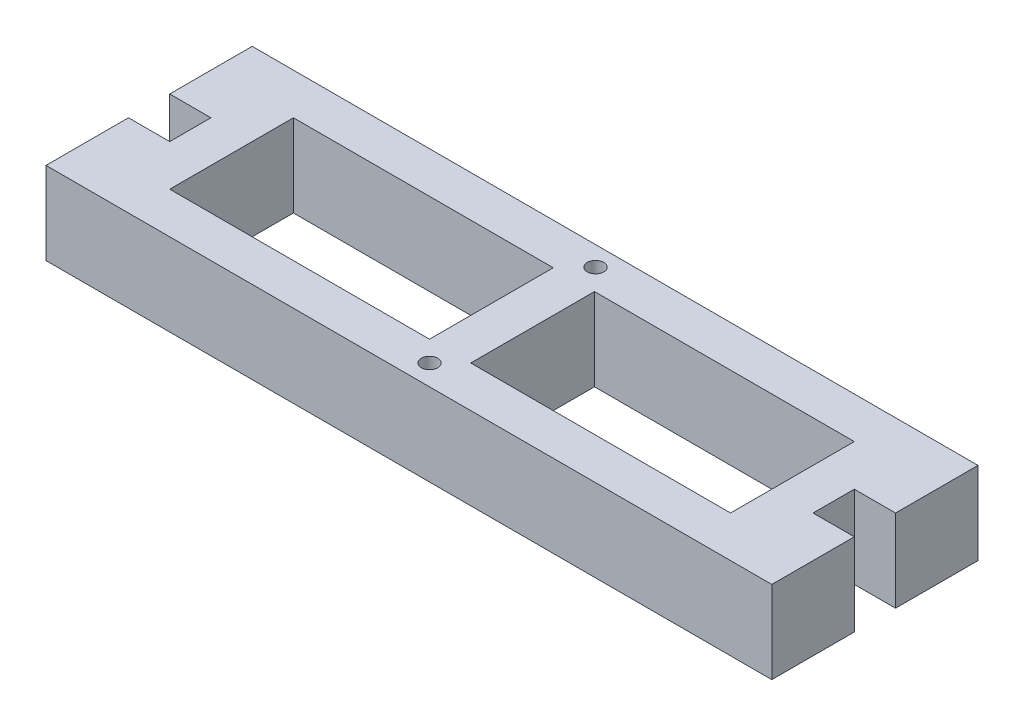
ISO-10303-21;
HEADER;
FILE_DESCRIPTION(('STEP AP214'),'2;1');
FILE_NAME('part.step','',(''),(''),'','','');
FILE_SCHEMA(('AUTOMOTIVE_DESIGN { 1 0 10303 214 1 1 1 1 }'));
ENDSEC;
DATA;
#1=APPLICATION_CONTEXT('core data for automotive mechanical design processes');
#2=APPLICATION_PROTOCOL_DEFINITION('international standard','automotive_design',2000,#1);
#3=PRODUCT_CONTEXT('',#1,'mechanical');
#4=PRODUCT('Part','Part','',(#3));
#5=PRODUCT_RELATED_PRODUCT_CATEGORY('part','',(#4));
#6=PRODUCT_DEFINITION_FORMATION('','',#4);
#7=PRODUCT_DEFINITION_CONTEXT('part definition',#1,'design');
#8=PRODUCT_DEFINITION('design','',#6,#7);
#9=PRODUCT_DEFINITION_SHAPE('','',#8);
#10=(LENGTH_UNIT() NAMED_UNIT(*) SI_UNIT(.MILLI.,.METRE.));
#11=(NAMED_UNIT(*) PLANE_ANGLE_UNIT() SI_UNIT($,.RADIAN.));
#12=(NAMED_UNIT(*) SI_UNIT($,.STERADIAN.) SOLID_ANGLE_UNIT());
#13=UNCERTAINTY_MEASURE_WITH_UNIT(LENGTH_MEASURE(1.E-05),#10,'distance_accuracy_value','');
#14=(GEOMETRIC_REPRESENTATION_CONTEXT(3) GLOBAL_UNCERTAINTY_ASSIGNED_CONTEXT((#13)) GLOBAL_UNIT_ASSIGNED_CONTEXT((#10,
#11,#12)) REPRESENTATION_CONTEXT('',''));
#15=CARTESIAN_POINT('',(0.,0.,0.));
#16=DIRECTION('',(0.,0.,1.));
#17=DIRECTION('',(1.,0.,0.));
#18=AXIS2_PLACEMENT_3D('',#15,#16,#17);
#19=CARTESIAN_POINT('',(0.,19.5,-10.1293473527723));
#20=DIRECTION('',(0.,-1.,0.));
#21=DIRECTION('',(0.,0.,-1.));
#22=AXIS2_PLACEMENT_3D('',#19,#20,#21);
#23=CYLINDRICAL_SURFACE('',#22,1.);
#24=CARTESIAN_POINT('',(0.,10.,-10.1293473527723));
#25=DIRECTION('',(0.,1.,0.));
#26=DIRECTION('',(0.,0.,1.));
#27=AXIS2_PLACEMENT_3D('',#24,#25,#26);
#28=CIRCLE('',#27,1.);
#29=CARTESIAN_POINT('',(0.,10.,-9.12934735277232));
#30=VERTEX_POINT('',#29);
#31=EDGE_CURVE('E347',#30,#30,#28,.T.);
#32=ORIENTED_EDGE('',*,*,#31,.T.);
#33=EDGE_LOOP('',(#32));
#34=FACE_BOUND('',#33,.T.);
#35=CARTESIAN_POINT('',(0.,1.5,-10.1293473527723));
#36=DIRECTION('',(0.,-1.,0.));
#37=DIRECTION('',(0.,0.,-1.));
#38=AXIS2_PLACEMENT_3D('',#35,#36,#37);
#39=CIRCLE('',#38,1.);
#40=CARTESIAN_POINT('',(0.,1.5,-11.1293473527723));
#41=VERTEX_POINT('',#40);
#42=EDGE_CURVE('E47',#41,#41,#39,.F.);
#43=ORIENTED_EDGE('',*,*,#42,.F.);
#44=EDGE_LOOP('',(#43));
#45=FACE_BOUND('',#44,.T.);
#46=ADVANCED_FACE('F43',(#34,#45),#23,.F.);
#47=CARTESIAN_POINT('',(-44.,0.,0.));
#48=DIRECTION('',(1.,0.,0.));
#49=DIRECTION('',(0.,0.,-1.));
#50=AXIS2_PLACEMENT_3D('',#47,#48,#49);
#51=PLANE('',#50);
#52=DIRECTION('',(0.,0.,1.));
#53=VECTOR('',#52,1.);
#54=CARTESIAN_POINT('',(-44.,0.,-12.5));
#55=LINE('',#54,#53);
#56=CARTESIAN_POINT('',(-44.,0.,-12.5));
#57=VERTEX_POINT('',#56);
#58=CARTESIAN_POINT('',(-44.,0.,-2.5));
#59=VERTEX_POINT('',#58);
#60=EDGE_CURVE('E262',#57,#59,#55,.T.);
#61=ORIENTED_EDGE('',*,*,#60,.T.);
#62=DIRECTION('',(0.,-1.,0.));
#63=VECTOR('',#62,1.);
#64=CARTESIAN_POINT('',(-44.,0.,-2.5));
#65=LINE('',#64,#63);
#66=CARTESIAN_POINT('',(-44.,10.,-2.5));
#67=VERTEX_POINT('',#66);
#68=EDGE_CURVE('E187',#67,#59,#65,.T.);
#69=ORIENTED_EDGE('',*,*,#68,.F.);
#70=DIRECTION('',(0.,0.,-1.));
#71=VECTOR('',#70,1.);
#72=CARTESIAN_POINT('',(-44.,10.,-12.5));
#73=LINE('',#72,#71);
#74=CARTESIAN_POINT('',(-44.,10.,-12.5));
#75=VERTEX_POINT('',#74);
#76=EDGE_CURVE('E266',#67,#75,#73,.T.);
#77=ORIENTED_EDGE('',*,*,#76,.T.);
#78=DIRECTION('',(0.,-1.,0.));
#79=VECTOR('',#78,1.);
#80=CARTESIAN_POINT('',(-44.,0.,-12.5));
#81=LINE('',#80,#79);
#82=EDGE_CURVE('E258',#75,#57,#81,.T.);
#83=ORIENTED_EDGE('',*,*,#82,.T.);
#84=EDGE_LOOP('',(#61,#69,#77,#83));
#85=FACE_BOUND('',#84,.T.);
#86=ADVANCED_FACE('F400',(#85),#51,.F.);
#87=CARTESIAN_POINT('',(44.,0.,0.));
#88=DIRECTION('',(-1.,0.,0.));
#89=DIRECTION('',(0.,0.,1.));
#90=AXIS2_PLACEMENT_3D('',#87,#88,#89);
#91=PLANE('',#90);
#92=DIRECTION('',(0.,0.,-1.));
#93=VECTOR('',#92,1.);
#94=CARTESIAN_POINT('',(44.,0.,-12.5));
#95=LINE('',#94,#93);
#96=CARTESIAN_POINT('',(44.,0.,12.5));
#97=VERTEX_POINT('',#96);
#98=CARTESIAN_POINT('',(44.,0.,2.5));
#99=VERTEX_POINT('',#98);
#100=EDGE_CURVE('E255',#97,#99,#95,.T.);
#101=ORIENTED_EDGE('',*,*,#100,.T.);
#102=DIRECTION('',(0.,-1.,0.));
#103=VECTOR('',#102,1.);
#104=CARTESIAN_POINT('',(44.,10.,2.5));
#105=LINE('',#104,#103);
#106=CARTESIAN_POINT('',(44.,10.,2.5));
#107=VERTEX_POINT('',#106);
#108=EDGE_CURVE('E217',#107,#99,#105,.T.);
#109=ORIENTED_EDGE('',*,*,#108,.F.);
#110=DIRECTION('',(0.,0.,1.));
#111=VECTOR('',#110,1.);
#112=CARTESIAN_POINT('',(44.,10.,-12.5));
#113=LINE('',#112,#111);
#114=CARTESIAN_POINT('',(44.,10.,12.5));
#115=VERTEX_POINT('',#114);
#116=EDGE_CURVE('E248',#107,#115,#113,.T.);
#117=ORIENTED_EDGE('',*,*,#116,.T.);
#118=DIRECTION('',(0.,-1.,0.));
#119=VECTOR('',#118,1.);
#120=CARTESIAN_POINT('',(44.,10.,12.5));
#121=LINE('',#120,#119);
#122=EDGE_CURVE('E252',#115,#97,#121,.T.);
#123=ORIENTED_EDGE('',*,*,#122,.T.);
#124=EDGE_LOOP('',(#101,#109,#117,#123));
#125=FACE_BOUND('',#124,.T.);
#126=ADVANCED_FACE('F408',(#125),#91,.F.);
#127=CARTESIAN_POINT('',(0.,10.,0.));
#128=DIRECTION('',(0.,1.,0.));
#129=DIRECTION('',(0.,0.,1.));
#130=AXIS2_PLACEMENT_3D('',#127,#128,#129);
#131=PLANE('',#130);
#132=ORIENTED_EDGE('',*,*,#31,.F.);
#133=EDGE_LOOP('',(#132));
#134=FACE_BOUND('',#133,.T.);
#135=CARTESIAN_POINT('',(0.,10.,10.));
#136=DIRECTION('',(0.,1.,0.));
#137=DIRECTION('',(0.,0.,1.));
#138=AXIS2_PLACEMENT_3D('',#135,#136,#137);
#139=CIRCLE('',#138,1.);
#140=CARTESIAN_POINT('',(0.,10.,11.));
#141=VERTEX_POINT('',#140);
#142=EDGE_CURVE('E339',#141,#141,#139,.T.);
#143=ORIENTED_EDGE('',*,*,#142,.F.);
#144=EDGE_LOOP('',(#143));
#145=FACE_BOUND('',#144,.T.);
#146=DIRECTION('',(-1.,0.,0.));
#147=VECTOR('',#146,1.);
#148=CARTESIAN_POINT('',(-39.,10.,-2.5));
#149=LINE('',#148,#147);
#150=CARTESIAN_POINT('',(-39.,10.,-2.5));
#151=VERTEX_POINT('',#150);
#152=EDGE_CURVE('E215',#151,#67,#149,.T.);
#153=ORIENTED_EDGE('',*,*,#152,.F.);
#154=DIRECTION('',(0.,0.,-1.));
#155=VECTOR('',#154,1.);
#156=CARTESIAN_POINT('',(-39.,10.,-2.5));
#157=LINE('',#156,#155);
#158=CARTESIAN_POINT('',(-39.,10.,2.5));
#159=VERTEX_POINT('',#158);
#160=EDGE_CURVE('E192',#159,#151,#157,.T.);
#161=ORIENTED_EDGE('',*,*,#160,.F.);
#162=DIRECTION('',(-1.,0.,0.));
#163=VECTOR('',#162,1.);
#164=CARTESIAN_POINT('',(-39.,10.,2.5));
#165=LINE('',#164,#163);
#166=CARTESIAN_POINT('',(-44.,10.,2.5));
#167=VERTEX_POINT('',#166);
#168=EDGE_CURVE('E218',#159,#167,#165,.T.);
#169=ORIENTED_EDGE('',*,*,#168,.T.);
#170=CARTESIAN_POINT('',(-44.,10.,12.5));
#171=VERTEX_POINT('',#170);
#172=EDGE_CURVE('E267',#171,#167,#73,.T.);
#173=ORIENTED_EDGE('',*,*,#172,.F.);
#174=DIRECTION('',(1.,0.,0.));
#175=VECTOR('',#174,1.);
#176=CARTESIAN_POINT('',(-49.,10.,12.5));
#177=LINE('',#176,#175);
#178=EDGE_CURVE('E11',#171,#115,#177,.T.);
#179=ORIENTED_EDGE('',*,*,#178,.T.);
#180=ORIENTED_EDGE('',*,*,#116,.F.);
#181=DIRECTION('',(1.,0.,0.));
#182=VECTOR('',#181,1.);
#183=CARTESIAN_POINT('',(39.,10.,2.5));
#184=LINE('',#183,#182);
#185=CARTESIAN_POINT('',(39.,10.,2.5));
#186=VERTEX_POINT('',#185);
#187=EDGE_CURVE('E238',#186,#107,#184,.T.);
#188=ORIENTED_EDGE('',*,*,#187,.F.);
#189=DIRECTION('',(0.,0.,1.));
#190=VECTOR('',#189,1.);
#191=CARTESIAN_POINT('',(39.,10.,2.5));
#192=LINE('',#191,#190);
#193=CARTESIAN_POINT('',(39.,10.,-2.5));
#194=VERTEX_POINT('',#193);
#195=EDGE_CURVE('E232',#194,#186,#192,.T.);
#196=ORIENTED_EDGE('',*,*,#195,.F.);
#197=DIRECTION('',(1.,0.,0.));
#198=VECTOR('',#197,1.);
#199=CARTESIAN_POINT('',(39.,10.,-2.5));
#200=LINE('',#199,#198);
#201=CARTESIAN_POINT('',(44.,10.,-2.5));
#202=VERTEX_POINT('',#201);
#203=EDGE_CURVE('E241',#194,#202,#200,.T.);
#204=ORIENTED_EDGE('',*,*,#203,.T.);
#205=CARTESIAN_POINT('',(44.,10.,-12.5));
#206=VERTEX_POINT('',#205);
#207=EDGE_CURVE('E249',#206,#202,#113,.T.);
#208=ORIENTED_EDGE('',*,*,#207,.F.);
#209=DIRECTION('',(-1.,0.,0.));
#210=VECTOR('',#209,1.);
#211=CARTESIAN_POINT('',(-49.,10.,-12.5));
#212=LINE('',#211,#210);
#213=EDGE_CURVE('E52',#206,#75,#212,.T.);
#214=ORIENTED_EDGE('',*,*,#213,.T.);
#215=ORIENTED_EDGE('',*,*,#76,.F.);
#216=EDGE_LOOP('',(#153,#161,#169,#173,#179,#180,#188,#196,#204,#208,#214,#215));
#217=FACE_BOUND('',#216,.T.);
#218=DIRECTION('',(-1.,0.,0.));
#219=VECTOR('',#218,1.);
#220=CARTESIAN_POINT('',(0.,10.,7.50000000000003));
#221=LINE('',#220,#219);
#222=CARTESIAN_POINT('',(34.,10.,7.50000000000003));
#223=VERTEX_POINT('',#222);
#224=CARTESIAN_POINT('',(2.5,10.,7.50000000000003));
#225=VERTEX_POINT('',#224);
#226=EDGE_CURVE('E319',#223,#225,#221,.T.);
#227=ORIENTED_EDGE('',*,*,#226,.T.);
#228=DIRECTION('',(0.,0.,-1.));
#229=VECTOR('',#228,1.);
#230=CARTESIAN_POINT('',(2.5,10.,0.));
#231=LINE('',#230,#229);
#232=CARTESIAN_POINT('',(2.5,10.,-7.5));
#233=VERTEX_POINT('',#232);
#234=EDGE_CURVE('E270',#225,#233,#231,.T.);
#235=ORIENTED_EDGE('',*,*,#234,.T.);
#236=DIRECTION('',(-1.,0.,0.));
#237=VECTOR('',#236,1.);
#238=CARTESIAN_POINT('',(0.,10.,-7.5));
#239=LINE('',#238,#237);
#240=CARTESIAN_POINT('',(34.,10.,-7.50000000000001));
#241=VERTEX_POINT('',#240);
#242=EDGE_CURVE('E308',#241,#233,#239,.T.);
#243=ORIENTED_EDGE('',*,*,#242,.F.);
#244=DIRECTION('',(0.,0.,1.));
#245=VECTOR('',#244,1.);
#246=CARTESIAN_POINT('',(34.,10.,0.));
#247=LINE('',#246,#245);
#248=EDGE_CURVE('E322',#241,#223,#247,.T.);
#249=ORIENTED_EDGE('',*,*,#248,.T.);
#250=EDGE_LOOP('',(#227,#235,#243,#249));
#251=FACE_BOUND('',#250,.T.);
#252=DIRECTION('',(-1.,0.,0.));
#253=VECTOR('',#252,1.);
#254=CARTESIAN_POINT('',(0.,10.,-7.5));
#255=LINE('',#254,#253);
#256=CARTESIAN_POINT('',(-2.5,10.,-7.5));
#257=VERTEX_POINT('',#256);
#258=CARTESIAN_POINT('',(-34.,10.,-7.5));
#259=VERTEX_POINT('',#258);
#260=EDGE_CURVE('E286',#257,#259,#255,.T.);
#261=ORIENTED_EDGE('',*,*,#260,.F.);
#262=DIRECTION('',(0.,0.,1.));
#263=VECTOR('',#262,1.);
#264=CARTESIAN_POINT('',(-2.5,10.,0.));
#265=LINE('',#264,#263);
#266=CARTESIAN_POINT('',(-2.5,10.,7.50000000000004));
#267=VERTEX_POINT('',#266);
#268=EDGE_CURVE('E283',#257,#267,#265,.T.);
#269=ORIENTED_EDGE('',*,*,#268,.T.);
#270=DIRECTION('',(-1.,0.,0.));
#271=VECTOR('',#270,1.);
#272=CARTESIAN_POINT('',(0.,10.,7.50000000000004));
#273=LINE('',#272,#271);
#274=CARTESIAN_POINT('',(-34.,10.,7.50000000000002));
#275=VERTEX_POINT('',#274);
#276=EDGE_CURVE('E274',#267,#275,#273,.T.);
#277=ORIENTED_EDGE('',*,*,#276,.T.);
#278=DIRECTION('',(0.,0.,-1.));
#279=VECTOR('',#278,1.);
#280=CARTESIAN_POINT('',(-34.,10.,0.));
#281=LINE('',#280,#279);
#282=EDGE_CURVE('E290',#275,#259,#281,.T.);
#283=ORIENTED_EDGE('',*,*,#282,.T.);
#284=EDGE_LOOP('',(#261,#269,#277,#283));
#285=FACE_BOUND('',#284,.T.);
#286=ADVANCED_FACE('F368',(#134,#145,#217,#251,#285),#131,.T.);
#287=CARTESIAN_POINT('',(0.,0.,0.));
#288=DIRECTION('',(0.,1.,0.));
#289=DIRECTION('',(0.,0.,1.));
#290=AXIS2_PLACEMENT_3D('',#287,#288,#289);
#291=PLANE('',#290);
#292=CARTESIAN_POINT('',(0.,0.,-10.1293473527723));
#293=DIRECTION('',(0.,-1.,0.));
#294=DIRECTION('',(0.,0.,-1.));
#295=AXIS2_PLACEMENT_3D('',#292,#293,#294);
#296=CIRCLE('',#295,1.75);
#297=CARTESIAN_POINT('',(0.,0.,-11.8793473527723));
#298=VERTEX_POINT('',#297);
#299=EDGE_CURVE('E610',#298,#298,#296,.T.);
#300=ORIENTED_EDGE('',*,*,#299,.F.);
#301=EDGE_LOOP('',(#300));
#302=FACE_BOUND('',#301,.T.);
#303=CARTESIAN_POINT('',(0.,0.,10.));
#304=DIRECTION('',(0.,-1.,0.));
#305=DIRECTION('',(0.,0.,-1.));
#306=AXIS2_PLACEMENT_3D('',#303,#304,#305);
#307=CIRCLE('',#306,1.75);
#308=CARTESIAN_POINT('',(0.,0.,8.25000000000002));
#309=VERTEX_POINT('',#308);
#310=EDGE_CURVE('E341',#309,#309,#307,.T.);
#311=ORIENTED_EDGE('',*,*,#310,.F.);
#312=EDGE_LOOP('',(#311));
#313=FACE_BOUND('',#312,.T.);
#314=DIRECTION('',(0.,0.,-1.));
#315=VECTOR('',#314,1.);
#316=CARTESIAN_POINT('',(2.5,0.,0.));
#317=LINE('',#316,#315);
#318=CARTESIAN_POINT('',(2.5,0.,7.50000000000003));
#319=VERTEX_POINT('',#318);
#320=CARTESIAN_POINT('',(2.5,0.,-7.5));
#321=VERTEX_POINT('',#320);
#322=EDGE_CURVE('E305',#319,#321,#317,.T.);
#323=ORIENTED_EDGE('',*,*,#322,.F.);
#324=DIRECTION('',(-1.,0.,0.));
#325=VECTOR('',#324,1.);
#326=CARTESIAN_POINT('',(0.,0.,7.50000000000003));
#327=LINE('',#326,#325);
#328=CARTESIAN_POINT('',(34.,0.,7.50000000000003));
#329=VERTEX_POINT('',#328);
#330=EDGE_CURVE('E307',#329,#319,#327,.T.);
#331=ORIENTED_EDGE('',*,*,#330,.F.);
#332=DIRECTION('',(0.,0.,1.));
#333=VECTOR('',#332,1.);
#334=CARTESIAN_POINT('',(34.,0.,0.));
#335=LINE('',#334,#333);
#336=CARTESIAN_POINT('',(34.,0.,-7.50000000000001));
#337=VERTEX_POINT('',#336);
#338=EDGE_CURVE('E310',#337,#329,#335,.T.);
#339=ORIENTED_EDGE('',*,*,#338,.F.);
#340=DIRECTION('',(-1.,0.,0.));
#341=VECTOR('',#340,1.);
#342=CARTESIAN_POINT('',(0.,0.,-7.5));
#343=LINE('',#342,#341);
#344=EDGE_CURVE('E313',#337,#321,#343,.T.);
#345=ORIENTED_EDGE('',*,*,#344,.T.);
#346=EDGE_LOOP('',(#323,#331,#339,#345));
#347=FACE_BOUND('',#346,.T.);
#348=DIRECTION('',(0.,0.,1.));
#349=VECTOR('',#348,1.);
#350=CARTESIAN_POINT('',(-39.,0.,-2.5));
#351=LINE('',#350,#349);
#352=CARTESIAN_POINT('',(-39.,0.,-2.5));
#353=VERTEX_POINT('',#352);
#354=CARTESIAN_POINT('',(-39.,0.,2.5));
#355=VERTEX_POINT('',#354);
#356=EDGE_CURVE('E198',#353,#355,#351,.T.);
#357=ORIENTED_EDGE('',*,*,#356,.F.);
#358=DIRECTION('',(-1.,0.,0.));
#359=VECTOR('',#358,1.);
#360=CARTESIAN_POINT('',(-39.,0.,-2.5));
#361=LINE('',#360,#359);
#362=EDGE_CURVE('E181',#353,#59,#361,.T.);
#363=ORIENTED_EDGE('',*,*,#362,.T.);
#364=ORIENTED_EDGE('',*,*,#60,.F.);
#365=DIRECTION('',(-1.,0.,0.));
#366=VECTOR('',#365,1.);
#367=CARTESIAN_POINT('',(-49.,0.,-12.5));
#368=LINE('',#367,#366);
#369=CARTESIAN_POINT('',(44.,0.,-12.5));
#370=VERTEX_POINT('',#369);
#371=EDGE_CURVE('E298',#370,#57,#368,.T.);
#372=ORIENTED_EDGE('',*,*,#371,.F.);
#373=CARTESIAN_POINT('',(44.,0.,-2.5));
#374=VERTEX_POINT('',#373);
#375=EDGE_CURVE('E254',#374,#370,#95,.T.);
#376=ORIENTED_EDGE('',*,*,#375,.F.);
#377=DIRECTION('',(1.,0.,0.));
#378=VECTOR('',#377,1.);
#379=CARTESIAN_POINT('',(39.,0.,-2.5));
#380=LINE('',#379,#378);
#381=CARTESIAN_POINT('',(39.,0.,-2.5));
#382=VERTEX_POINT('',#381);
#383=EDGE_CURVE('E68',#382,#374,#380,.T.);
#384=ORIENTED_EDGE('',*,*,#383,.F.);
#385=DIRECTION('',(0.,0.,-1.));
#386=VECTOR('',#385,1.);
#387=CARTESIAN_POINT('',(39.,0.,-2.5));
#388=LINE('',#387,#386);
#389=CARTESIAN_POINT('',(39.,0.,2.5));
#390=VERTEX_POINT('',#389);
#391=EDGE_CURVE('E225',#390,#382,#388,.T.);
#392=ORIENTED_EDGE('',*,*,#391,.F.);
#393=DIRECTION('',(1.,0.,0.));
#394=VECTOR('',#393,1.);
#395=CARTESIAN_POINT('',(39.,0.,2.5));
#396=LINE('',#395,#394);
#397=EDGE_CURVE('E235',#390,#99,#396,.T.);
#398=ORIENTED_EDGE('',*,*,#397,.T.);
#399=ORIENTED_EDGE('',*,*,#100,.F.);
#400=DIRECTION('',(1.,0.,0.));
#401=VECTOR('',#400,1.);
#402=CARTESIAN_POINT('',(-49.,0.,12.5));
#403=LINE('',#402,#401);
#404=CARTESIAN_POINT('',(-44.,0.,12.5));
#405=VERTEX_POINT('',#404);
#406=EDGE_CURVE('E335',#405,#97,#403,.T.);
#407=ORIENTED_EDGE('',*,*,#406,.F.);
#408=CARTESIAN_POINT('',(-44.,0.,2.5));
#409=VERTEX_POINT('',#408);
#410=EDGE_CURVE('E261',#409,#405,#55,.T.);
#411=ORIENTED_EDGE('',*,*,#410,.F.);
#412=DIRECTION('',(-1.,0.,0.));
#413=VECTOR('',#412,1.);
#414=CARTESIAN_POINT('',(-39.,0.,2.5));
#415=LINE('',#414,#413);
#416=EDGE_CURVE('E60',#355,#409,#415,.T.);
#417=ORIENTED_EDGE('',*,*,#416,.F.);
#418=EDGE_LOOP('',(#357,#363,#364,#372,#376,#384,#392,#398,#399,#407,#411,#417));
#419=FACE_BOUND('',#418,.T.);
#420=DIRECTION('',(0.,0.,1.));
#421=VECTOR('',#420,1.);
#422=CARTESIAN_POINT('',(-2.5,0.,0.));
#423=LINE('',#422,#421);
#424=CARTESIAN_POINT('',(-2.5,0.,-7.5));
#425=VERTEX_POINT('',#424);
#426=CARTESIAN_POINT('',(-2.5,0.,7.50000000000004));
#427=VERTEX_POINT('',#426);
#428=EDGE_CURVE('E271',#425,#427,#423,.T.);
#429=ORIENTED_EDGE('',*,*,#428,.F.);
#430=DIRECTION('',(-1.,0.,0.));
#431=VECTOR('',#430,1.);
#432=CARTESIAN_POINT('',(0.,0.,-7.5));
#433=LINE('',#432,#431);
#434=CARTESIAN_POINT('',(-34.,0.,-7.5));
#435=VERTEX_POINT('',#434);
#436=EDGE_CURVE('E273',#425,#435,#433,.T.);
#437=ORIENTED_EDGE('',*,*,#436,.T.);
#438=DIRECTION('',(0.,0.,-1.));
#439=VECTOR('',#438,1.);
#440=CARTESIAN_POINT('',(-34.,0.,0.));
#441=LINE('',#440,#439);
#442=CARTESIAN_POINT('',(-34.,0.,7.50000000000002));
#443=VERTEX_POINT('',#442);
#444=EDGE_CURVE('E277',#443,#435,#441,.T.);
#445=ORIENTED_EDGE('',*,*,#444,.F.);
#446=DIRECTION('',(-1.,0.,0.));
#447=VECTOR('',#446,1.);
#448=CARTESIAN_POINT('',(0.,0.,7.50000000000004));
#449=LINE('',#448,#447);
#450=EDGE_CURVE('E280',#427,#443,#449,.T.);
#451=ORIENTED_EDGE('',*,*,#450,.F.);
#452=EDGE_LOOP('',(#429,#437,#445,#451));
#453=FACE_BOUND('',#452,.T.);
#454=ADVANCED_FACE('F203',(#302,#313,#347,#419,#453),#291,.F.);
#455=CARTESIAN_POINT('',(-49.,10.,-12.5));
#456=DIRECTION('',(0.,0.,1.));
#457=DIRECTION('',(1.,0.,0.));
#458=AXIS2_PLACEMENT_3D('',#455,#456,#457);
#459=PLANE('',#458);
#460=ORIENTED_EDGE('',*,*,#213,.F.);
#461=DIRECTION('',(0.,1.,0.));
#462=VECTOR('',#461,1.);
#463=CARTESIAN_POINT('',(44.,10.,-12.5));
#464=LINE('',#463,#462);
#465=EDGE_CURVE('E240',#370,#206,#464,.T.);
#466=ORIENTED_EDGE('',*,*,#465,.F.);
#467=ORIENTED_EDGE('',*,*,#371,.T.);
#468=ORIENTED_EDGE('',*,*,#82,.F.);
#469=EDGE_LOOP('',(#460,#466,#467,#468));
#470=FACE_BOUND('',#469,.T.);
#471=ADVANCED_FACE('F45',(#470),#459,.F.);
#472=CARTESIAN_POINT('',(-49.,10.,12.5));
#473=DIRECTION('',(0.,0.,-1.));
#474=DIRECTION('',(-1.,0.,0.));
#475=AXIS2_PLACEMENT_3D('',#472,#473,#474);
#476=PLANE('',#475);
#477=ORIENTED_EDGE('',*,*,#406,.T.);
#478=ORIENTED_EDGE('',*,*,#122,.F.);
#479=ORIENTED_EDGE('',*,*,#178,.F.);
#480=DIRECTION('',(0.,1.,0.));
#481=VECTOR('',#480,1.);
#482=CARTESIAN_POINT('',(-44.,0.,12.5));
#483=LINE('',#482,#481);
#484=EDGE_CURVE('E264',#405,#171,#483,.T.);
#485=ORIENTED_EDGE('',*,*,#484,.F.);
#486=EDGE_LOOP('',(#477,#478,#479,#485));
#487=FACE_BOUND('',#486,.T.);
#488=ADVANCED_FACE('F482',(#487),#476,.F.);
#489=CARTESIAN_POINT('',(2.5,0.,0.));
#490=DIRECTION('',(1.,0.,0.));
#491=DIRECTION('',(0.,0.,-1.));
#492=AXIS2_PLACEMENT_3D('',#489,#490,#491);
#493=PLANE('',#492);
#494=ORIENTED_EDGE('',*,*,#234,.F.);
#495=DIRECTION('',(0.,1.,0.));
#496=VECTOR('',#495,1.);
#497=CARTESIAN_POINT('',(2.5,0.,7.50000000000003));
#498=LINE('',#497,#496);
#499=EDGE_CURVE('E316',#319,#225,#498,.T.);
#500=ORIENTED_EDGE('',*,*,#499,.F.);
#501=ORIENTED_EDGE('',*,*,#322,.T.);
#502=DIRECTION('',(0.,1.,0.));
#503=VECTOR('',#502,1.);
#504=CARTESIAN_POINT('',(2.5,0.,-7.5));
#505=LINE('',#504,#503);
#506=EDGE_CURVE('E287',#321,#233,#505,.T.);
#507=ORIENTED_EDGE('',*,*,#506,.T.);
#508=EDGE_LOOP('',(#494,#500,#501,#507));
#509=FACE_BOUND('',#508,.T.);
#510=ADVANCED_FACE('F378',(#509),#493,.T.);
#511=CARTESIAN_POINT('',(0.,0.,-7.5));
#512=DIRECTION('',(0.,0.,-1.));
#513=DIRECTION('',(-1.,0.,0.));
#514=AXIS2_PLACEMENT_3D('',#511,#512,#513);
#515=PLANE('',#514);
#516=ORIENTED_EDGE('',*,*,#242,.T.);
#517=ORIENTED_EDGE('',*,*,#506,.F.);
#518=ORIENTED_EDGE('',*,*,#344,.F.);
#519=DIRECTION('',(0.,1.,0.));
#520=VECTOR('',#519,1.);
#521=CARTESIAN_POINT('',(34.,0.,-7.50000000000001));
#522=LINE('',#521,#520);
#523=EDGE_CURVE('E328',#337,#241,#522,.T.);
#524=ORIENTED_EDGE('',*,*,#523,.T.);
#525=EDGE_LOOP('',(#516,#517,#518,#524));
#526=FACE_BOUND('',#525,.T.);
#527=ADVANCED_FACE('F380',(#526),#515,.F.);
#528=CARTESIAN_POINT('',(34.,0.,0.));
#529=DIRECTION('',(-1.,0.,0.));
#530=DIRECTION('',(0.,0.,1.));
#531=AXIS2_PLACEMENT_3D('',#528,#529,#530);
#532=PLANE('',#531);
#533=ORIENTED_EDGE('',*,*,#248,.F.);
#534=ORIENTED_EDGE('',*,*,#523,.F.);
#535=ORIENTED_EDGE('',*,*,#338,.T.);
#536=DIRECTION('',(0.,1.,0.));
#537=VECTOR('',#536,1.);
#538=CARTESIAN_POINT('',(34.,0.,7.50000000000003));
#539=LINE('',#538,#537);
#540=EDGE_CURVE('E330',#329,#223,#539,.T.);
#541=ORIENTED_EDGE('',*,*,#540,.T.);
#542=EDGE_LOOP('',(#533,#534,#535,#541));
#543=FACE_BOUND('',#542,.T.);
#544=ADVANCED_FACE('F389',(#543),#532,.T.);
#545=CARTESIAN_POINT('',(0.,0.,7.50000000000003));
#546=DIRECTION('',(0.,0.,-1.));
#547=DIRECTION('',(-1.,0.,0.));
#548=AXIS2_PLACEMENT_3D('',#545,#546,#547);
#549=PLANE('',#548);
#550=ORIENTED_EDGE('',*,*,#226,.F.);
#551=ORIENTED_EDGE('',*,*,#540,.F.);
#552=ORIENTED_EDGE('',*,*,#330,.T.);
#553=ORIENTED_EDGE('',*,*,#499,.T.);
#554=EDGE_LOOP('',(#550,#551,#552,#553));
#555=FACE_BOUND('',#554,.T.);
#556=ADVANCED_FACE('F387',(#555),#549,.T.);
#557=CARTESIAN_POINT('',(-2.5,0.,0.));
#558=DIRECTION('',(-1.,0.,0.));
#559=DIRECTION('',(0.,0.,1.));
#560=AXIS2_PLACEMENT_3D('',#557,#558,#559);
#561=PLANE('',#560);
#562=ORIENTED_EDGE('',*,*,#268,.F.);
#563=DIRECTION('',(0.,1.,0.));
#564=VECTOR('',#563,1.);
#565=CARTESIAN_POINT('',(-2.5,0.,-7.5));
#566=LINE('',#565,#564);
#567=EDGE_CURVE('E282',#425,#257,#566,.T.);
#568=ORIENTED_EDGE('',*,*,#567,.F.);
#569=ORIENTED_EDGE('',*,*,#428,.T.);
#570=DIRECTION('',(0.,1.,0.));
#571=VECTOR('',#570,1.);
#572=CARTESIAN_POINT('',(-2.5,0.,7.50000000000004));
#573=LINE('',#572,#571);
#574=EDGE_CURVE('E295',#427,#267,#573,.T.);
#575=ORIENTED_EDGE('',*,*,#574,.T.);
#576=EDGE_LOOP('',(#562,#568,#569,#575));
#577=FACE_BOUND('',#576,.T.);
#578=ADVANCED_FACE('F396',(#577),#561,.T.);
#579=CARTESIAN_POINT('',(0.,0.,7.50000000000004));
#580=DIRECTION('',(0.,0.,-1.));
#581=DIRECTION('',(-1.,0.,0.));
#582=AXIS2_PLACEMENT_3D('',#579,#580,#581);
#583=PLANE('',#582);
#584=ORIENTED_EDGE('',*,*,#276,.F.);
#585=ORIENTED_EDGE('',*,*,#574,.F.);
#586=ORIENTED_EDGE('',*,*,#450,.T.);
#587=DIRECTION('',(0.,1.,0.));
#588=VECTOR('',#587,1.);
#589=CARTESIAN_POINT('',(-34.,0.,7.50000000000002));
#590=LINE('',#589,#588);
#591=EDGE_CURVE('E299',#443,#275,#590,.T.);
#592=ORIENTED_EDGE('',*,*,#591,.T.);
#593=EDGE_LOOP('',(#584,#585,#586,#592));
#594=FACE_BOUND('',#593,.T.);
#595=ADVANCED_FACE('F448',(#594),#583,.T.);
#596=CARTESIAN_POINT('',(-34.,0.,0.));
#597=DIRECTION('',(1.,0.,0.));
#598=DIRECTION('',(0.,0.,-1.));
#599=AXIS2_PLACEMENT_3D('',#596,#597,#598);
#600=PLANE('',#599);
#601=ORIENTED_EDGE('',*,*,#282,.F.);
#602=ORIENTED_EDGE('',*,*,#591,.F.);
#603=ORIENTED_EDGE('',*,*,#444,.T.);
#604=DIRECTION('',(0.,1.,0.));
#605=VECTOR('',#604,1.);
#606=CARTESIAN_POINT('',(-34.,0.,-7.5));
#607=LINE('',#606,#605);
#608=EDGE_CURVE('E301',#435,#259,#607,.T.);
#609=ORIENTED_EDGE('',*,*,#608,.T.);
#610=EDGE_LOOP('',(#601,#602,#603,#609));
#611=FACE_BOUND('',#610,.T.);
#612=ADVANCED_FACE('F451',(#611),#600,.T.);
#613=CARTESIAN_POINT('',(0.,0.,-7.5));
#614=DIRECTION('',(0.,0.,-1.));
#615=DIRECTION('',(-1.,0.,0.));
#616=AXIS2_PLACEMENT_3D('',#613,#614,#615);
#617=PLANE('',#616);
#618=ORIENTED_EDGE('',*,*,#260,.T.);
#619=ORIENTED_EDGE('',*,*,#608,.F.);
#620=ORIENTED_EDGE('',*,*,#436,.F.);
#621=ORIENTED_EDGE('',*,*,#567,.T.);
#622=EDGE_LOOP('',(#618,#619,#620,#621));
#623=FACE_BOUND('',#622,.T.);
#624=ADVANCED_FACE('F446',(#623),#617,.F.);
#625=ORIENTED_EDGE('',*,*,#172,.T.);
#626=DIRECTION('',(0.,1.,0.));
#627=VECTOR('',#626,1.);
#628=CARTESIAN_POINT('',(-44.,0.,2.5));
#629=LINE('',#628,#627);
#630=EDGE_CURVE('E201',#409,#167,#629,.T.);
#631=ORIENTED_EDGE('',*,*,#630,.F.);
#632=ORIENTED_EDGE('',*,*,#410,.T.);
#633=ORIENTED_EDGE('',*,*,#484,.T.);
#634=EDGE_LOOP('',(#625,#631,#632,#633));
#635=FACE_BOUND('',#634,.T.);
#636=ADVANCED_FACE('F411',(#635),#51,.F.);
#637=ORIENTED_EDGE('',*,*,#207,.T.);
#638=DIRECTION('',(0.,1.,0.));
#639=VECTOR('',#638,1.);
#640=CARTESIAN_POINT('',(44.,10.,-2.5));
#641=LINE('',#640,#639);
#642=EDGE_CURVE('E226',#374,#202,#641,.T.);
#643=ORIENTED_EDGE('',*,*,#642,.F.);
#644=ORIENTED_EDGE('',*,*,#375,.T.);
#645=ORIENTED_EDGE('',*,*,#465,.T.);
#646=EDGE_LOOP('',(#637,#643,#644,#645));
#647=FACE_BOUND('',#646,.T.);
#648=ADVANCED_FACE('F440',(#647),#91,.F.);
#649=CARTESIAN_POINT('',(39.,10.,2.5));
#650=DIRECTION('',(0.,0.,1.));
#651=DIRECTION('',(0.,-1.,0.));
#652=AXIS2_PLACEMENT_3D('',#649,#650,#651);
#653=PLANE('',#652);
#654=ORIENTED_EDGE('',*,*,#108,.T.);
#655=ORIENTED_EDGE('',*,*,#397,.F.);
#656=DIRECTION('',(0.,-1.,0.));
#657=VECTOR('',#656,1.);
#658=CARTESIAN_POINT('',(39.,10.,2.5));
#659=LINE('',#658,#657);
#660=EDGE_CURVE('E222',#186,#390,#659,.T.);
#661=ORIENTED_EDGE('',*,*,#660,.F.);
#662=ORIENTED_EDGE('',*,*,#187,.T.);
#663=EDGE_LOOP('',(#654,#655,#661,#662));
#664=FACE_BOUND('',#663,.T.);
#665=ADVANCED_FACE('F437',(#664),#653,.F.);
#666=CARTESIAN_POINT('',(39.,10.,-2.5));
#667=DIRECTION('',(0.,0.,-1.));
#668=DIRECTION('',(0.,1.,0.));
#669=AXIS2_PLACEMENT_3D('',#666,#667,#668);
#670=PLANE('',#669);
#671=ORIENTED_EDGE('',*,*,#642,.T.);
#672=ORIENTED_EDGE('',*,*,#203,.F.);
#673=DIRECTION('',(0.,1.,0.));
#674=VECTOR('',#673,1.);
#675=CARTESIAN_POINT('',(39.,10.,-2.5));
#676=LINE('',#675,#674);
#677=EDGE_CURVE('E229',#382,#194,#676,.T.);
#678=ORIENTED_EDGE('',*,*,#677,.F.);
#679=ORIENTED_EDGE('',*,*,#383,.T.);
#680=EDGE_LOOP('',(#671,#672,#678,#679));
#681=FACE_BOUND('',#680,.T.);
#682=ADVANCED_FACE('F433',(#681),#670,.F.);
#683=CARTESIAN_POINT('',(39.,0.,0.));
#684=DIRECTION('',(-1.,0.,0.));
#685=DIRECTION('',(0.,0.,1.));
#686=AXIS2_PLACEMENT_3D('',#683,#684,#685);
#687=PLANE('',#686);
#688=ORIENTED_EDGE('',*,*,#660,.T.);
#689=ORIENTED_EDGE('',*,*,#391,.T.);
#690=ORIENTED_EDGE('',*,*,#677,.T.);
#691=ORIENTED_EDGE('',*,*,#195,.T.);
#692=EDGE_LOOP('',(#688,#689,#690,#691));
#693=FACE_BOUND('',#692,.T.);
#694=ADVANCED_FACE('F430',(#693),#687,.F.);
#695=CARTESIAN_POINT('',(-39.,0.,-2.5));
#696=DIRECTION('',(0.,0.,-1.));
#697=DIRECTION('',(-1.,0.,0.));
#698=AXIS2_PLACEMENT_3D('',#695,#696,#697);
#699=PLANE('',#698);
#700=ORIENTED_EDGE('',*,*,#68,.T.);
#701=ORIENTED_EDGE('',*,*,#362,.F.);
#702=DIRECTION('',(0.,-1.,0.));
#703=VECTOR('',#702,1.);
#704=CARTESIAN_POINT('',(-39.,0.,-2.5));
#705=LINE('',#704,#703);
#706=EDGE_CURVE('E184',#151,#353,#705,.T.);
#707=ORIENTED_EDGE('',*,*,#706,.F.);
#708=ORIENTED_EDGE('',*,*,#152,.T.);
#709=EDGE_LOOP('',(#700,#701,#707,#708));
#710=FACE_BOUND('',#709,.T.);
#711=ADVANCED_FACE('F183',(#710),#699,.F.);
#712=CARTESIAN_POINT('',(-39.,0.,2.5));
#713=DIRECTION('',(0.,0.,1.));
#714=DIRECTION('',(1.,0.,0.));
#715=AXIS2_PLACEMENT_3D('',#712,#713,#714);
#716=PLANE('',#715);
#717=ORIENTED_EDGE('',*,*,#630,.T.);
#718=ORIENTED_EDGE('',*,*,#168,.F.);
#719=DIRECTION('',(0.,1.,0.));
#720=VECTOR('',#719,1.);
#721=CARTESIAN_POINT('',(-39.,0.,2.5));
#722=LINE('',#721,#720);
#723=EDGE_CURVE('E206',#355,#159,#722,.T.);
#724=ORIENTED_EDGE('',*,*,#723,.F.);
#725=ORIENTED_EDGE('',*,*,#416,.T.);
#726=EDGE_LOOP('',(#717,#718,#724,#725));
#727=FACE_BOUND('',#726,.T.);
#728=ADVANCED_FACE('F425',(#727),#716,.F.);
#729=CARTESIAN_POINT('',(-39.,0.,0.));
#730=DIRECTION('',(1.,0.,0.));
#731=DIRECTION('',(0.,0.,-1.));
#732=AXIS2_PLACEMENT_3D('',#729,#730,#731);
#733=PLANE('',#732);
#734=ORIENTED_EDGE('',*,*,#706,.T.);
#735=ORIENTED_EDGE('',*,*,#356,.T.);
#736=ORIENTED_EDGE('',*,*,#723,.T.);
#737=ORIENTED_EDGE('',*,*,#160,.T.);
#738=EDGE_LOOP('',(#734,#735,#736,#737));
#739=FACE_BOUND('',#738,.T.);
#740=ADVANCED_FACE('F196',(#739),#733,.F.);
#741=CARTESIAN_POINT('',(0.,1.5,10.));
#742=DIRECTION('',(0.,-1.,0.));
#743=DIRECTION('',(0.,0.,-1.));
#744=AXIS2_PLACEMENT_3D('',#741,#742,#743);
#745=CYLINDRICAL_SURFACE('',#744,1.75);
#746=CARTESIAN_POINT('',(0.,1.5,10.));
#747=DIRECTION('',(0.,-1.,0.));
#748=DIRECTION('',(0.,0.,-1.));
#749=AXIS2_PLACEMENT_3D('',#746,#747,#748);
#750=CIRCLE('',#749,1.75);
#751=CARTESIAN_POINT('',(0.,1.5,8.25000000000002));
#752=VERTEX_POINT('',#751);
#753=EDGE_CURVE('E213',#752,#752,#750,.T.);
#754=ORIENTED_EDGE('',*,*,#753,.F.);
#755=EDGE_LOOP('',(#754));
#756=FACE_BOUND('',#755,.T.);
#757=ORIENTED_EDGE('',*,*,#310,.T.);
#758=EDGE_LOOP('',(#757));
#759=FACE_BOUND('',#758,.T.);
#760=ADVANCED_FACE('F360',(#756,#759),#745,.F.);
#761=CARTESIAN_POINT('',(0.,1.5,0.));
#762=DIRECTION('',(0.,-1.,0.));
#763=DIRECTION('',(0.,0.,-1.));
#764=AXIS2_PLACEMENT_3D('',#761,#762,#763);
#765=PLANE('',#764);
#766=CARTESIAN_POINT('',(0.,1.5,10.));
#767=DIRECTION('',(0.,-1.,0.));
#768=DIRECTION('',(0.,0.,-1.));
#769=AXIS2_PLACEMENT_3D('',#766,#767,#768);
#770=CIRCLE('',#769,1.);
#771=CARTESIAN_POINT('',(0.,1.5,9.00000000000002));
#772=VERTEX_POINT('',#771);
#773=EDGE_CURVE('E342',#772,#772,#770,.T.);
#774=ORIENTED_EDGE('',*,*,#773,.F.);
#775=EDGE_LOOP('',(#774));
#776=FACE_BOUND('',#775,.T.);
#777=ORIENTED_EDGE('',*,*,#753,.T.);
#778=EDGE_LOOP('',(#777));
#779=FACE_BOUND('',#778,.T.);
#780=ADVANCED_FACE('F358',(#776,#779),#765,.T.);
#781=CARTESIAN_POINT('',(0.,13.,10.));
#782=DIRECTION('',(0.,-1.,0.));
#783=DIRECTION('',(0.,0.,-1.));
#784=AXIS2_PLACEMENT_3D('',#781,#782,#783);
#785=CYLINDRICAL_SURFACE('',#784,1.);
#786=ORIENTED_EDGE('',*,*,#142,.T.);
#787=EDGE_LOOP('',(#786));
#788=FACE_BOUND('',#787,.T.);
#789=ORIENTED_EDGE('',*,*,#773,.T.);
#790=EDGE_LOOP('',(#789));
#791=FACE_BOUND('',#790,.T.);
#792=ADVANCED_FACE('F417',(#788,#791),#785,.F.);
#793=CARTESIAN_POINT('',(0.,1.5,-10.1293473527723));
#794=DIRECTION('',(0.,-1.,0.));
#795=DIRECTION('',(0.,0.,-1.));
#796=AXIS2_PLACEMENT_3D('',#793,#794,#795);
#797=PLANE('',#796);
#798=CARTESIAN_POINT('',(0.,1.5,-10.1293473527723));
#799=DIRECTION('',(0.,-1.,0.));
#800=DIRECTION('',(0.,0.,-1.));
#801=AXIS2_PLACEMENT_3D('',#798,#799,#800);
#802=CIRCLE('',#801,1.75);
#803=CARTESIAN_POINT('',(0.,1.5,-11.8793473527723));
#804=VERTEX_POINT('',#803);
#805=EDGE_CURVE('E607',#804,#804,#802,.T.);
#806=ORIENTED_EDGE('',*,*,#805,.T.);
#807=EDGE_LOOP('',(#806));
#808=FACE_BOUND('',#807,.T.);
#809=ORIENTED_EDGE('',*,*,#42,.T.);
#810=EDGE_LOOP('',(#809));
#811=FACE_BOUND('',#810,.T.);
#812=ADVANCED_FACE('F419',(#808,#811),#797,.T.);
#813=CARTESIAN_POINT('',(0.,1.5,-10.1293473527723));
#814=DIRECTION('',(0.,-1.,0.));
#815=DIRECTION('',(0.,0.,-1.));
#816=AXIS2_PLACEMENT_3D('',#813,#814,#815);
#817=CYLINDRICAL_SURFACE('',#816,1.75);
#818=ORIENTED_EDGE('',*,*,#805,.F.);
#819=EDGE_LOOP('',(#818));
#820=FACE_BOUND('',#819,.T.);
#821=ORIENTED_EDGE('',*,*,#299,.T.);
#822=EDGE_LOOP('',(#821));
#823=FACE_BOUND('',#822,.T.);
#824=ADVANCED_FACE('F415',(#820,#823),#817,.F.);
#825=CLOSED_SHELL('',(#46,#86,#126,#286,#454,#471,#488,#510,#527,#544,#556,#578,#595,#612,#624,
#636,#648,#665,#682,#694,#711,#728,#740,#760,#780,#792,#812,#824));
#826=MANIFOLD_SOLID_BREP('B2',#825);
#827=ADVANCED_BREP_SHAPE_REPRESENTATION('',(#18,#826),#14);
#828=SHAPE_DEFINITION_REPRESENTATION(#9,#827);
ENDSEC;
END-ISO-10303-21;
